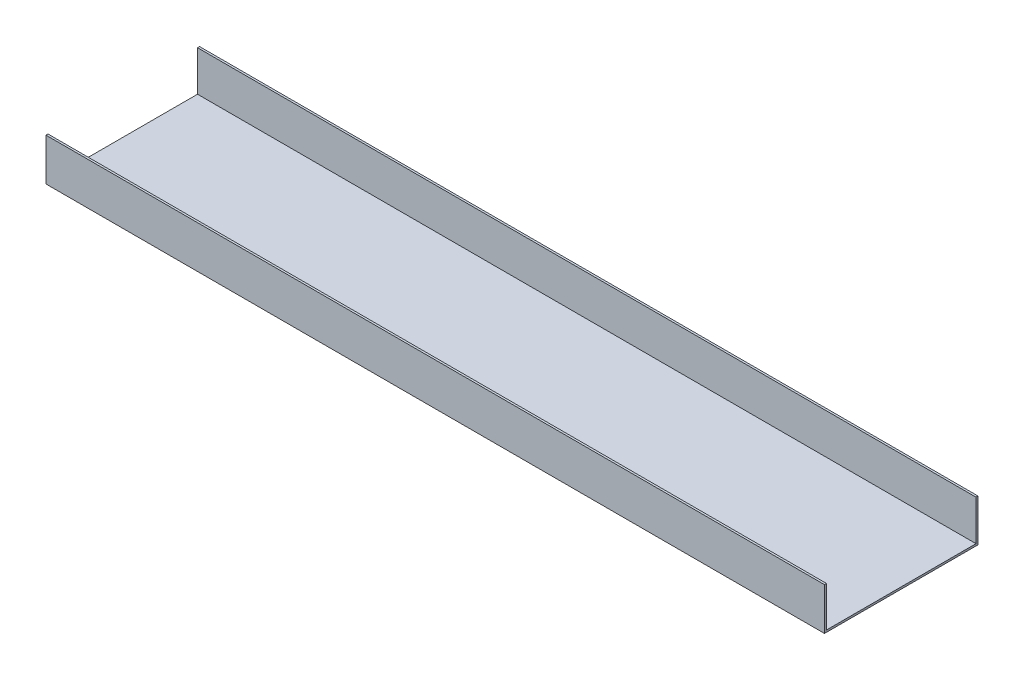
ISO-10303-21;
HEADER;
FILE_DESCRIPTION(('STEP AP214'),'2;1');
FILE_NAME('part.step','',(''),(''),'','','');
FILE_SCHEMA(('AUTOMOTIVE_DESIGN { 1 0 10303 214 1 1 1 1 }'));
ENDSEC;
DATA;
#1=APPLICATION_CONTEXT('core data for automotive mechanical design processes');
#2=APPLICATION_PROTOCOL_DEFINITION('international standard','automotive_design',2000,#1);
#3=PRODUCT_CONTEXT('',#1,'mechanical');
#4=PRODUCT('Part','Part','',(#3));
#5=PRODUCT_RELATED_PRODUCT_CATEGORY('part','',(#4));
#6=PRODUCT_DEFINITION_FORMATION('','',#4);
#7=PRODUCT_DEFINITION_CONTEXT('part definition',#1,'design');
#8=PRODUCT_DEFINITION('design','',#6,#7);
#9=PRODUCT_DEFINITION_SHAPE('','',#8);
#10=(LENGTH_UNIT() NAMED_UNIT(*) SI_UNIT(.MILLI.,.METRE.));
#11=(NAMED_UNIT(*) PLANE_ANGLE_UNIT() SI_UNIT($,.RADIAN.));
#12=(NAMED_UNIT(*) SI_UNIT($,.STERADIAN.) SOLID_ANGLE_UNIT());
#13=UNCERTAINTY_MEASURE_WITH_UNIT(LENGTH_MEASURE(1.E-05),#10,'distance_accuracy_value','');
#14=(GEOMETRIC_REPRESENTATION_CONTEXT(3) GLOBAL_UNCERTAINTY_ASSIGNED_CONTEXT((#13)) GLOBAL_UNIT_ASSIGNED_CONTEXT((#10,
#11,#12)) REPRESENTATION_CONTEXT('',''));
#15=CARTESIAN_POINT('',(0.,0.,0.));
#16=DIRECTION('',(0.,0.,1.));
#17=DIRECTION('',(1.,0.,0.));
#18=AXIS2_PLACEMENT_3D('',#15,#16,#17);
#19=CARTESIAN_POINT('',(0.,1.,0.));
#20=DIRECTION('',(0.,1.,0.));
#21=DIRECTION('',(0.,0.,1.));
#22=AXIS2_PLACEMENT_3D('',#19,#20,#21);
#23=PLANE('',#22);
#24=DIRECTION('',(0.,0.,-1.));
#25=VECTOR('',#24,1.);
#26=CARTESIAN_POINT('',(193.2,1.,-38.1));
#27=LINE('',#26,#25);
#28=CARTESIAN_POINT('',(193.2,1.,37.1));
#29=VERTEX_POINT('',#28);
#30=CARTESIAN_POINT('',(193.2,1.,-37.1));
#31=VERTEX_POINT('',#30);
#32=EDGE_CURVE('E59',#29,#31,#27,.T.);
#33=ORIENTED_EDGE('',*,*,#32,.T.);
#34=DIRECTION('',(1.,0.,0.));
#35=VECTOR('',#34,1.);
#36=CARTESIAN_POINT('',(-193.2,1.,-37.1));
#37=LINE('',#36,#35);
#38=CARTESIAN_POINT('',(-193.2,1.,-37.1));
#39=VERTEX_POINT('',#38);
#40=EDGE_CURVE('E124',#39,#31,#37,.T.);
#41=ORIENTED_EDGE('',*,*,#40,.F.);
#42=DIRECTION('',(0.,0.,1.));
#43=VECTOR('',#42,1.);
#44=CARTESIAN_POINT('',(-193.2,1.,-38.1));
#45=LINE('',#44,#43);
#46=CARTESIAN_POINT('',(-193.2,1.,37.1));
#47=VERTEX_POINT('',#46);
#48=EDGE_CURVE('E173',#39,#47,#45,.T.);
#49=ORIENTED_EDGE('',*,*,#48,.T.);
#50=DIRECTION('',(1.,0.,0.));
#51=VECTOR('',#50,1.);
#52=CARTESIAN_POINT('',(-193.2,1.,37.1));
#53=LINE('',#52,#51);
#54=EDGE_CURVE('E131',#47,#29,#53,.T.);
#55=ORIENTED_EDGE('',*,*,#54,.T.);
#56=EDGE_LOOP('',(#33,#41,#49,#55));
#57=FACE_BOUND('',#56,.T.);
#58=ADVANCED_FACE('F43',(#57),#23,.T.);
#59=CARTESIAN_POINT('',(193.2,1.,-38.1));
#60=DIRECTION('',(-1.,0.,0.));
#61=DIRECTION('',(0.,0.,1.));
#62=AXIS2_PLACEMENT_3D('',#59,#60,#61);
#63=PLANE('',#62);
#64=DIRECTION('',(0.,0.,-1.));
#65=VECTOR('',#64,1.);
#66=CARTESIAN_POINT('',(193.2,0.,-38.1));
#67=LINE('',#66,#65);
#68=CARTESIAN_POINT('',(193.2,0.,38.1));
#69=VERTEX_POINT('',#68);
#70=CARTESIAN_POINT('',(193.2,0.,-38.1));
#71=VERTEX_POINT('',#70);
#72=EDGE_CURVE('E170',#69,#71,#67,.T.);
#73=ORIENTED_EDGE('',*,*,#72,.T.);
#74=DIRECTION('',(0.,-1.,0.));
#75=VECTOR('',#74,1.);
#76=CARTESIAN_POINT('',(193.2,1.,-38.1));
#77=LINE('',#76,#75);
#78=CARTESIAN_POINT('',(193.2,21.,-38.1));
#79=VERTEX_POINT('',#78);
#80=EDGE_CURVE('E11',#79,#71,#77,.T.);
#81=ORIENTED_EDGE('',*,*,#80,.F.);
#82=DIRECTION('',(0.,0.,1.));
#83=VECTOR('',#82,1.);
#84=CARTESIAN_POINT('',(193.2,21.,-38.1));
#85=LINE('',#84,#83);
#86=CARTESIAN_POINT('',(193.2,21.,-37.1));
#87=VERTEX_POINT('',#86);
#88=EDGE_CURVE('E117',#79,#87,#85,.T.);
#89=ORIENTED_EDGE('',*,*,#88,.T.);
#90=DIRECTION('',(0.,-1.,0.));
#91=VECTOR('',#90,1.);
#92=CARTESIAN_POINT('',(193.2,21.,-37.1));
#93=LINE('',#92,#91);
#94=EDGE_CURVE('E127',#87,#31,#93,.T.);
#95=ORIENTED_EDGE('',*,*,#94,.T.);
#96=ORIENTED_EDGE('',*,*,#32,.F.);
#97=DIRECTION('',(0.,-1.,0.));
#98=VECTOR('',#97,1.);
#99=CARTESIAN_POINT('',(193.2,21.,37.1));
#100=LINE('',#99,#98);
#101=CARTESIAN_POINT('',(193.2,21.,37.1));
#102=VERTEX_POINT('',#101);
#103=EDGE_CURVE('E67',#102,#29,#100,.T.);
#104=ORIENTED_EDGE('',*,*,#103,.F.);
#105=DIRECTION('',(0.,0.,1.));
#106=VECTOR('',#105,1.);
#107=CARTESIAN_POINT('',(193.2,21.,37.1));
#108=LINE('',#107,#106);
#109=CARTESIAN_POINT('',(193.2,21.,38.1));
#110=VERTEX_POINT('',#109);
#111=EDGE_CURVE('E151',#102,#110,#108,.T.);
#112=ORIENTED_EDGE('',*,*,#111,.T.);
#113=DIRECTION('',(0.,-1.,0.));
#114=VECTOR('',#113,1.);
#115=CARTESIAN_POINT('',(193.2,1.,38.1));
#116=LINE('',#115,#114);
#117=EDGE_CURVE('E177',#110,#69,#116,.T.);
#118=ORIENTED_EDGE('',*,*,#117,.T.);
#119=EDGE_LOOP('',(#73,#81,#89,#95,#96,#104,#112,#118));
#120=FACE_BOUND('',#119,.T.);
#121=ADVANCED_FACE('F45',(#120),#63,.F.);
#122=CARTESIAN_POINT('',(-193.2,1.,-38.1));
#123=DIRECTION('',(0.,0.,1.));
#124=DIRECTION('',(1.,0.,0.));
#125=AXIS2_PLACEMENT_3D('',#122,#123,#124);
#126=PLANE('',#125);
#127=DIRECTION('',(-1.,0.,0.));
#128=VECTOR('',#127,1.);
#129=CARTESIAN_POINT('',(-193.2,0.,-38.1));
#130=LINE('',#129,#128);
#131=CARTESIAN_POINT('',(-193.2,0.,-38.1));
#132=VERTEX_POINT('',#131);
#133=EDGE_CURVE('E180',#71,#132,#130,.T.);
#134=ORIENTED_EDGE('',*,*,#133,.T.);
#135=DIRECTION('',(0.,-1.,0.));
#136=VECTOR('',#135,1.);
#137=CARTESIAN_POINT('',(-193.2,1.,-38.1));
#138=LINE('',#137,#136);
#139=CARTESIAN_POINT('',(-193.2,21.,-38.1));
#140=VERTEX_POINT('',#139);
#141=EDGE_CURVE('E52',#140,#132,#138,.T.);
#142=ORIENTED_EDGE('',*,*,#141,.F.);
#143=DIRECTION('',(1.,0.,0.));
#144=VECTOR('',#143,1.);
#145=CARTESIAN_POINT('',(-193.2,21.,-38.1));
#146=LINE('',#145,#144);
#147=EDGE_CURVE('E136',#140,#79,#146,.T.);
#148=ORIENTED_EDGE('',*,*,#147,.T.);
#149=ORIENTED_EDGE('',*,*,#80,.T.);
#150=EDGE_LOOP('',(#134,#142,#148,#149));
#151=FACE_BOUND('',#150,.T.);
#152=ADVANCED_FACE('F218',(#151),#126,.F.);
#153=CARTESIAN_POINT('',(-193.2,1.,-38.1));
#154=DIRECTION('',(1.,0.,0.));
#155=DIRECTION('',(0.,0.,-1.));
#156=AXIS2_PLACEMENT_3D('',#153,#154,#155);
#157=PLANE('',#156);
#158=DIRECTION('',(0.,0.,1.));
#159=VECTOR('',#158,1.);
#160=CARTESIAN_POINT('',(-193.2,0.,-38.1));
#161=LINE('',#160,#159);
#162=CARTESIAN_POINT('',(-193.2,0.,38.1));
#163=VERTEX_POINT('',#162);
#164=EDGE_CURVE('E183',#132,#163,#161,.T.);
#165=ORIENTED_EDGE('',*,*,#164,.T.);
#166=DIRECTION('',(0.,-1.,0.));
#167=VECTOR('',#166,1.);
#168=CARTESIAN_POINT('',(-193.2,1.,38.1));
#169=LINE('',#168,#167);
#170=CARTESIAN_POINT('',(-193.2,21.,38.1));
#171=VERTEX_POINT('',#170);
#172=EDGE_CURVE('E191',#171,#163,#169,.T.);
#173=ORIENTED_EDGE('',*,*,#172,.F.);
#174=DIRECTION('',(0.,0.,-1.));
#175=VECTOR('',#174,1.);
#176=CARTESIAN_POINT('',(-193.2,21.,38.1));
#177=LINE('',#176,#175);
#178=CARTESIAN_POINT('',(-193.2,21.,37.1));
#179=VERTEX_POINT('',#178);
#180=EDGE_CURVE('E158',#171,#179,#177,.T.);
#181=ORIENTED_EDGE('',*,*,#180,.T.);
#182=DIRECTION('',(0.,-1.,0.));
#183=VECTOR('',#182,1.);
#184=CARTESIAN_POINT('',(-193.2,21.,37.1));
#185=LINE('',#184,#183);
#186=EDGE_CURVE('E162',#179,#47,#185,.T.);
#187=ORIENTED_EDGE('',*,*,#186,.T.);
#188=ORIENTED_EDGE('',*,*,#48,.F.);
#189=DIRECTION('',(0.,-1.,0.));
#190=VECTOR('',#189,1.);
#191=CARTESIAN_POINT('',(-193.2,21.,-37.1));
#192=LINE('',#191,#190);
#193=CARTESIAN_POINT('',(-193.2,21.,-37.1));
#194=VERTEX_POINT('',#193);
#195=EDGE_CURVE('E132',#194,#39,#192,.T.);
#196=ORIENTED_EDGE('',*,*,#195,.F.);
#197=DIRECTION('',(0.,0.,-1.));
#198=VECTOR('',#197,1.);
#199=CARTESIAN_POINT('',(-193.2,21.,-37.1));
#200=LINE('',#199,#198);
#201=EDGE_CURVE('E120',#194,#140,#200,.T.);
#202=ORIENTED_EDGE('',*,*,#201,.T.);
#203=ORIENTED_EDGE('',*,*,#141,.T.);
#204=EDGE_LOOP('',(#165,#173,#181,#187,#188,#196,#202,#203));
#205=FACE_BOUND('',#204,.T.);
#206=ADVANCED_FACE('F198',(#205),#157,.F.);
#207=CARTESIAN_POINT('',(-193.2,1.,38.1));
#208=DIRECTION('',(0.,0.,-1.));
#209=DIRECTION('',(-1.,0.,0.));
#210=AXIS2_PLACEMENT_3D('',#207,#208,#209);
#211=PLANE('',#210);
#212=DIRECTION('',(1.,0.,0.));
#213=VECTOR('',#212,1.);
#214=CARTESIAN_POINT('',(-193.2,0.,38.1));
#215=LINE('',#214,#213);
#216=EDGE_CURVE('E174',#163,#69,#215,.T.);
#217=ORIENTED_EDGE('',*,*,#216,.T.);
#218=ORIENTED_EDGE('',*,*,#117,.F.);
#219=DIRECTION('',(1.,0.,0.));
#220=VECTOR('',#219,1.);
#221=CARTESIAN_POINT('',(-193.2,21.,38.1));
#222=LINE('',#221,#220);
#223=EDGE_CURVE('E147',#171,#110,#222,.T.);
#224=ORIENTED_EDGE('',*,*,#223,.F.);
#225=ORIENTED_EDGE('',*,*,#172,.T.);
#226=EDGE_LOOP('',(#217,#218,#224,#225));
#227=FACE_BOUND('',#226,.T.);
#228=ADVANCED_FACE('F205',(#227),#211,.F.);
#229=CARTESIAN_POINT('',(0.,0.,0.));
#230=DIRECTION('',(0.,1.,0.));
#231=DIRECTION('',(0.,0.,1.));
#232=AXIS2_PLACEMENT_3D('',#229,#230,#231);
#233=PLANE('',#232);
#234=ORIENTED_EDGE('',*,*,#72,.F.);
#235=ORIENTED_EDGE('',*,*,#216,.F.);
#236=ORIENTED_EDGE('',*,*,#164,.F.);
#237=ORIENTED_EDGE('',*,*,#133,.F.);
#238=EDGE_LOOP('',(#234,#235,#236,#237));
#239=FACE_BOUND('',#238,.T.);
#240=ADVANCED_FACE('F203',(#239),#233,.F.);
#241=CARTESIAN_POINT('',(-193.2,21.,37.1));
#242=DIRECTION('',(0.,0.,-1.));
#243=DIRECTION('',(-1.,0.,0.));
#244=AXIS2_PLACEMENT_3D('',#241,#242,#243);
#245=PLANE('',#244);
#246=ORIENTED_EDGE('',*,*,#54,.F.);
#247=ORIENTED_EDGE('',*,*,#186,.F.);
#248=DIRECTION('',(1.,0.,0.));
#249=VECTOR('',#248,1.);
#250=CARTESIAN_POINT('',(-193.2,21.,37.1));
#251=LINE('',#250,#249);
#252=EDGE_CURVE('E155',#179,#102,#251,.T.);
#253=ORIENTED_EDGE('',*,*,#252,.T.);
#254=ORIENTED_EDGE('',*,*,#103,.T.);
#255=EDGE_LOOP('',(#246,#247,#253,#254));
#256=FACE_BOUND('',#255,.T.);
#257=ADVANCED_FACE('F212',(#256),#245,.T.);
#258=CARTESIAN_POINT('',(0.,21.,0.));
#259=DIRECTION('',(0.,-1.,0.));
#260=DIRECTION('',(-1.,0.,0.));
#261=AXIS2_PLACEMENT_3D('',#258,#259,#260);
#262=PLANE('',#261);
#263=ORIENTED_EDGE('',*,*,#223,.T.);
#264=ORIENTED_EDGE('',*,*,#111,.F.);
#265=ORIENTED_EDGE('',*,*,#252,.F.);
#266=ORIENTED_EDGE('',*,*,#180,.F.);
#267=EDGE_LOOP('',(#263,#264,#265,#266));
#268=FACE_BOUND('',#267,.T.);
#269=ADVANCED_FACE('F210',(#268),#262,.F.);
#270=CARTESIAN_POINT('',(-193.2,21.,-37.1));
#271=DIRECTION('',(0.,0.,-1.));
#272=DIRECTION('',(-1.,0.,0.));
#273=AXIS2_PLACEMENT_3D('',#270,#271,#272);
#274=PLANE('',#273);
#275=ORIENTED_EDGE('',*,*,#40,.T.);
#276=ORIENTED_EDGE('',*,*,#94,.F.);
#277=DIRECTION('',(1.,0.,0.));
#278=VECTOR('',#277,1.);
#279=CARTESIAN_POINT('',(-193.2,21.,-37.1));
#280=LINE('',#279,#278);
#281=EDGE_CURVE('E112',#194,#87,#280,.T.);
#282=ORIENTED_EDGE('',*,*,#281,.F.);
#283=ORIENTED_EDGE('',*,*,#195,.T.);
#284=EDGE_LOOP('',(#275,#276,#282,#283));
#285=FACE_BOUND('',#284,.T.);
#286=ADVANCED_FACE('F128',(#285),#274,.F.);
#287=CARTESIAN_POINT('',(0.,21.,0.));
#288=DIRECTION('',(0.,-1.,0.));
#289=DIRECTION('',(-1.,0.,0.));
#290=AXIS2_PLACEMENT_3D('',#287,#288,#289);
#291=PLANE('',#290);
#292=ORIENTED_EDGE('',*,*,#281,.T.);
#293=ORIENTED_EDGE('',*,*,#88,.F.);
#294=ORIENTED_EDGE('',*,*,#147,.F.);
#295=ORIENTED_EDGE('',*,*,#201,.F.);
#296=EDGE_LOOP('',(#292,#293,#294,#295));
#297=FACE_BOUND('',#296,.T.);
#298=ADVANCED_FACE('F114',(#297),#291,.F.);
#299=CLOSED_SHELL('',(#58,#121,#152,#206,#228,#240,#257,#269,#286,#298));
#300=MANIFOLD_SOLID_BREP('B2',#299);
#301=ADVANCED_BREP_SHAPE_REPRESENTATION('',(#18,#300),#14);
#302=SHAPE_DEFINITION_REPRESENTATION(#9,#301);
ENDSEC;
END-ISO-10303-21;
